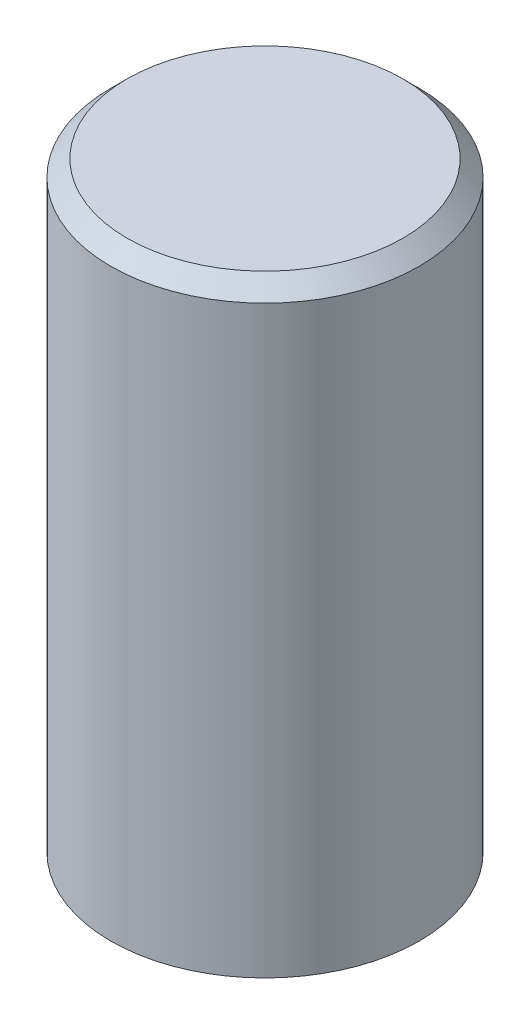
ISO-10303-21;
HEADER;
FILE_DESCRIPTION(('STEP AP214'),'2;1');
FILE_NAME('part.step','',(''),(''),'','','');
FILE_SCHEMA(('AUTOMOTIVE_DESIGN { 1 0 10303 214 1 1 1 1 }'));
ENDSEC;
DATA;
#1=APPLICATION_CONTEXT('core data for automotive mechanical design processes');
#2=APPLICATION_PROTOCOL_DEFINITION('international standard','automotive_design',2000,#1);
#3=PRODUCT_CONTEXT('',#1,'mechanical');
#4=PRODUCT('Part','Part','',(#3));
#5=PRODUCT_RELATED_PRODUCT_CATEGORY('part','',(#4));
#6=PRODUCT_DEFINITION_FORMATION('','',#4);
#7=PRODUCT_DEFINITION_CONTEXT('part definition',#1,'design');
#8=PRODUCT_DEFINITION('design','',#6,#7);
#9=PRODUCT_DEFINITION_SHAPE('','',#8);
#10=(LENGTH_UNIT() NAMED_UNIT(*) SI_UNIT(.MILLI.,.METRE.));
#11=(NAMED_UNIT(*) PLANE_ANGLE_UNIT() SI_UNIT($,.RADIAN.));
#12=(NAMED_UNIT(*) SI_UNIT($,.STERADIAN.) SOLID_ANGLE_UNIT());
#13=UNCERTAINTY_MEASURE_WITH_UNIT(LENGTH_MEASURE(1.E-05),#10,'distance_accuracy_value','');
#14=(GEOMETRIC_REPRESENTATION_CONTEXT(3) GLOBAL_UNCERTAINTY_ASSIGNED_CONTEXT((#13)) GLOBAL_UNIT_ASSIGNED_CONTEXT((#10,
#11,#12)) REPRESENTATION_CONTEXT('',''));
#15=CARTESIAN_POINT('',(0.,0.,0.));
#16=DIRECTION('',(0.,0.,1.));
#17=DIRECTION('',(1.,0.,0.));
#18=AXIS2_PLACEMENT_3D('',#15,#16,#17);
#19=CARTESIAN_POINT('',(0.,37.,0.));
#20=DIRECTION('',(0.,-1.,0.));
#21=DIRECTION('',(0.,0.,-1.));
#22=AXIS2_PLACEMENT_3D('',#19,#20,#21);
#23=CYLINDRICAL_SURFACE('',#22,9.5);
#24=CARTESIAN_POINT('',(0.,36.,0.));
#25=DIRECTION('',(0.,1.,0.));
#26=DIRECTION('',(0.,0.,1.));
#27=AXIS2_PLACEMENT_3D('',#24,#25,#26);
#28=CIRCLE('',#27,9.5);
#29=CARTESIAN_POINT('',(0.,36.,9.5));
#30=VERTEX_POINT('',#29);
#31=EDGE_CURVE('E61',#30,#30,#28,.F.);
#32=ORIENTED_EDGE('',*,*,#31,.T.);
#33=EDGE_LOOP('',(#32));
#34=FACE_BOUND('',#33,.T.);
#35=CARTESIAN_POINT('',(0.,0.,0.));
#36=DIRECTION('',(0.,1.,0.));
#37=DIRECTION('',(0.,0.,1.));
#38=AXIS2_PLACEMENT_3D('',#35,#36,#37);
#39=CIRCLE('',#38,9.5);
#40=CARTESIAN_POINT('',(0.,0.,9.5));
#41=VERTEX_POINT('',#40);
#42=EDGE_CURVE('E72',#41,#41,#39,.T.);
#43=ORIENTED_EDGE('',*,*,#42,.T.);
#44=EDGE_LOOP('',(#43));
#45=FACE_BOUND('',#44,.T.);
#46=ADVANCED_FACE('F47',(#34,#45),#23,.T.);
#47=CARTESIAN_POINT('',(0.,37.,0.));
#48=DIRECTION('',(0.,1.,0.));
#49=DIRECTION('',(0.,0.,1.));
#50=AXIS2_PLACEMENT_3D('',#47,#48,#49);
#51=PLANE('',#50);
#52=CARTESIAN_POINT('',(0.,37.,0.));
#53=DIRECTION('',(0.,1.,0.));
#54=DIRECTION('',(0.,0.,1.));
#55=AXIS2_PLACEMENT_3D('',#52,#53,#54);
#56=CIRCLE('',#55,8.5);
#57=CARTESIAN_POINT('',(0.,37.,8.5));
#58=VERTEX_POINT('',#57);
#59=EDGE_CURVE('E66',#58,#58,#56,.T.);
#60=ORIENTED_EDGE('',*,*,#59,.T.);
#61=EDGE_LOOP('',(#60));
#62=FACE_BOUND('',#61,.T.);
#63=ADVANCED_FACE('F94',(#62),#51,.T.);
#64=CARTESIAN_POINT('',(0.,0.,0.));
#65=DIRECTION('',(0.,1.,0.));
#66=DIRECTION('',(0.,0.,1.));
#67=AXIS2_PLACEMENT_3D('',#64,#65,#66);
#68=PLANE('',#67);
#69=CARTESIAN_POINT('',(0.,0.,0.));
#70=DIRECTION('',(0.,1.,0.));
#71=DIRECTION('',(0.,0.,1.));
#72=AXIS2_PLACEMENT_3D('',#69,#70,#71);
#73=CIRCLE('',#72,7.99999999999999);
#74=CARTESIAN_POINT('',(0.,0.,7.99999999999999));
#75=VERTEX_POINT('',#74);
#76=EDGE_CURVE('E10',#75,#75,#73,.T.);
#77=ORIENTED_EDGE('',*,*,#76,.T.);
#78=EDGE_LOOP('',(#77));
#79=FACE_BOUND('',#78,.T.);
#80=ORIENTED_EDGE('',*,*,#42,.F.);
#81=EDGE_LOOP('',(#80));
#82=FACE_BOUND('',#81,.T.);
#83=ADVANCED_FACE('F85',(#79,#82),#68,.F.);
#84=CARTESIAN_POINT('',(0.,7.,0.));
#85=DIRECTION('',(0.,-1.,0.));
#86=DIRECTION('',(0.,0.,-1.));
#87=AXIS2_PLACEMENT_3D('',#84,#85,#86);
#88=CYLINDRICAL_SURFACE('',#87,7.5);
#89=CARTESIAN_POINT('',(0.,0.499999999999993,0.));
#90=DIRECTION('',(0.,1.,0.));
#91=DIRECTION('',(0.,0.,1.));
#92=AXIS2_PLACEMENT_3D('',#89,#90,#91);
#93=CIRCLE('',#92,7.5);
#94=CARTESIAN_POINT('',(0.,0.499999999999993,7.5));
#95=VERTEX_POINT('',#94);
#96=EDGE_CURVE('E56',#95,#95,#93,.F.);
#97=ORIENTED_EDGE('',*,*,#96,.T.);
#98=EDGE_LOOP('',(#97));
#99=FACE_BOUND('',#98,.T.);
#100=CARTESIAN_POINT('',(0.,7.,0.));
#101=DIRECTION('',(0.,-1.,0.));
#102=DIRECTION('',(0.,0.,-1.));
#103=AXIS2_PLACEMENT_3D('',#100,#101,#102);
#104=CIRCLE('',#103,7.5);
#105=CARTESIAN_POINT('',(0.,7.,-7.5));
#106=VERTEX_POINT('',#105);
#107=EDGE_CURVE('E76',#106,#106,#104,.T.);
#108=ORIENTED_EDGE('',*,*,#107,.F.);
#109=EDGE_LOOP('',(#108));
#110=FACE_BOUND('',#109,.T.);
#111=ADVANCED_FACE('F83',(#99,#110),#88,.F.);
#112=CARTESIAN_POINT('',(0.,7.,0.));
#113=DIRECTION('',(0.,-1.,0.));
#114=DIRECTION('',(0.,0.,-1.));
#115=AXIS2_PLACEMENT_3D('',#112,#113,#114);
#116=PLANE('',#115);
#117=ORIENTED_EDGE('',*,*,#107,.T.);
#118=EDGE_LOOP('',(#117));
#119=FACE_BOUND('',#118,.T.);
#120=ADVANCED_FACE('F81',(#119),#116,.T.);
#121=CARTESIAN_POINT('',(0.,37.,0.));
#122=DIRECTION('',(0.,-1.,0.));
#123=DIRECTION('',(0.,0.,-1.));
#124=AXIS2_PLACEMENT_3D('',#121,#122,#123);
#125=CONICAL_SURFACE('',#124,8.5,0.785398163397444);
#126=ORIENTED_EDGE('',*,*,#31,.F.);
#127=EDGE_LOOP('',(#126));
#128=FACE_BOUND('',#127,.T.);
#129=ORIENTED_EDGE('',*,*,#59,.F.);
#130=EDGE_LOOP('',(#129));
#131=FACE_BOUND('',#130,.T.);
#132=ADVANCED_FACE('F92',(#128,#131),#125,.T.);
#133=CARTESIAN_POINT('',(0.,0.499999999999993,0.));
#134=DIRECTION('',(0.,-1.,0.));
#135=DIRECTION('',(0.,0.,-1.));
#136=AXIS2_PLACEMENT_3D('',#133,#134,#135);
#137=CONICAL_SURFACE('',#136,7.5,0.785398163397449);
#138=ORIENTED_EDGE('',*,*,#76,.F.);
#139=EDGE_LOOP('',(#138));
#140=FACE_BOUND('',#139,.T.);
#141=ORIENTED_EDGE('',*,*,#96,.F.);
#142=EDGE_LOOP('',(#141));
#143=FACE_BOUND('',#142,.T.);
#144=ADVANCED_FACE('F50',(#140,#143),#137,.F.);
#145=CLOSED_SHELL('',(#46,#63,#83,#111,#120,#132,#144));
#146=MANIFOLD_SOLID_BREP('B2',#145);
#147=ADVANCED_BREP_SHAPE_REPRESENTATION('',(#18,#146),#14);
#148=SHAPE_DEFINITION_REPRESENTATION(#9,#147);
ENDSEC;
END-ISO-10303-21;
